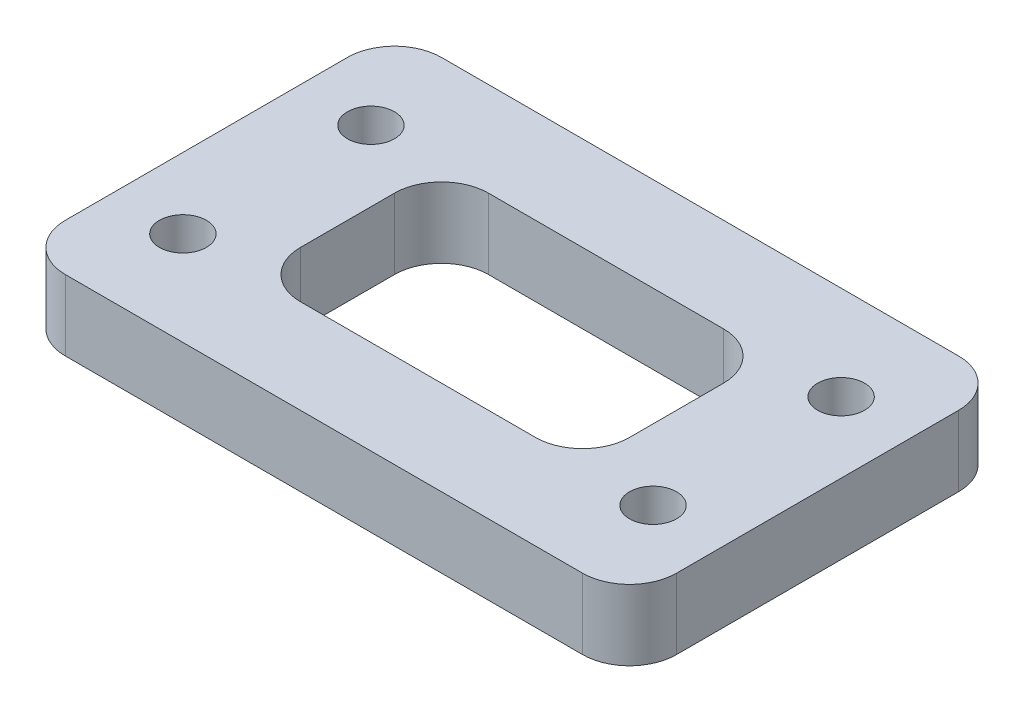
ISO-10303-21;
HEADER;
FILE_DESCRIPTION(('STEP AP214'),'2;1');
FILE_NAME('part.step','',(''),(''),'','','');
FILE_SCHEMA(('AUTOMOTIVE_DESIGN { 1 0 10303 214 1 1 1 1 }'));
ENDSEC;
DATA;
#1=APPLICATION_CONTEXT('core data for automotive mechanical design processes');
#2=APPLICATION_PROTOCOL_DEFINITION('international standard','automotive_design',2000,#1);
#3=PRODUCT_CONTEXT('',#1,'mechanical');
#4=PRODUCT('Part','Part','',(#3));
#5=PRODUCT_RELATED_PRODUCT_CATEGORY('part','',(#4));
#6=PRODUCT_DEFINITION_FORMATION('','',#4);
#7=PRODUCT_DEFINITION_CONTEXT('part definition',#1,'design');
#8=PRODUCT_DEFINITION('design','',#6,#7);
#9=PRODUCT_DEFINITION_SHAPE('','',#8);
#10=(LENGTH_UNIT() NAMED_UNIT(*) SI_UNIT(.MILLI.,.METRE.));
#11=(NAMED_UNIT(*) PLANE_ANGLE_UNIT() SI_UNIT($,.RADIAN.));
#12=(NAMED_UNIT(*) SI_UNIT($,.STERADIAN.) SOLID_ANGLE_UNIT());
#13=UNCERTAINTY_MEASURE_WITH_UNIT(LENGTH_MEASURE(1.E-05),#10,'distance_accuracy_value','');
#14=(GEOMETRIC_REPRESENTATION_CONTEXT(3) GLOBAL_UNCERTAINTY_ASSIGNED_CONTEXT((#13)) GLOBAL_UNIT_ASSIGNED_CONTEXT((#10,
#11,#12)) REPRESENTATION_CONTEXT('',''));
#15=CARTESIAN_POINT('',(0.,0.,0.));
#16=DIRECTION('',(0.,0.,1.));
#17=DIRECTION('',(1.,0.,0.));
#18=AXIS2_PLACEMENT_3D('',#15,#16,#17);
#19=CARTESIAN_POINT('',(27.5,7.5,-15.));
#20=DIRECTION('',(0.,1.,0.));
#21=DIRECTION('',(0.,0.,1.));
#22=AXIS2_PLACEMENT_3D('',#19,#20,#21);
#23=PLANE('',#22);
#24=CARTESIAN_POINT('',(-25.0000000000001,7.5,10.0000000000001));
#25=DIRECTION('',(0.,1.,0.));
#26=DIRECTION('',(0.,0.,-1.));
#27=AXIS2_PLACEMENT_3D('',#24,#25,#26);
#28=CIRCLE('',#27,2.5);
#29=CARTESIAN_POINT('',(-25.0000000000001,7.5,7.50000000000007));
#30=VERTEX_POINT('',#29);
#31=EDGE_CURVE('E211',#30,#30,#28,.T.);
#32=ORIENTED_EDGE('',*,*,#31,.F.);
#33=EDGE_LOOP('',(#32));
#34=FACE_BOUND('',#33,.T.);
#35=CARTESIAN_POINT('',(25.,7.5,-9.99999999999999));
#36=DIRECTION('',(0.,1.,0.));
#37=DIRECTION('',(0.,0.,1.));
#38=AXIS2_PLACEMENT_3D('',#35,#36,#37);
#39=CIRCLE('',#38,2.5);
#40=CARTESIAN_POINT('',(25.,7.5,-7.49999999999999));
#41=VERTEX_POINT('',#40);
#42=EDGE_CURVE('E223',#41,#41,#39,.T.);
#43=ORIENTED_EDGE('',*,*,#42,.F.);
#44=EDGE_LOOP('',(#43));
#45=FACE_BOUND('',#44,.T.);
#46=CARTESIAN_POINT('',(27.5,7.5,-15.));
#47=DIRECTION('',(0.,1.,0.));
#48=DIRECTION('',(0.,0.,1.));
#49=AXIS2_PLACEMENT_3D('',#46,#47,#48);
#50=CIRCLE('',#49,5.);
#51=CARTESIAN_POINT('',(32.5,7.5,-15.));
#52=VERTEX_POINT('',#51);
#53=CARTESIAN_POINT('',(27.5,7.5,-20.));
#54=VERTEX_POINT('',#53);
#55=EDGE_CURVE('E235',#52,#54,#50,.T.);
#56=ORIENTED_EDGE('',*,*,#55,.T.);
#57=DIRECTION('',(-1.,0.,0.));
#58=VECTOR('',#57,1.);
#59=CARTESIAN_POINT('',(27.5,7.5,-20.));
#60=LINE('',#59,#58);
#61=CARTESIAN_POINT('',(-27.5,7.5,-20.));
#62=VERTEX_POINT('',#61);
#63=EDGE_CURVE('E238',#54,#62,#60,.T.);
#64=ORIENTED_EDGE('',*,*,#63,.T.);
#65=CARTESIAN_POINT('',(-27.5,7.5,-15.));
#66=DIRECTION('',(0.,1.,0.));
#67=DIRECTION('',(0.,0.,-1.));
#68=AXIS2_PLACEMENT_3D('',#65,#66,#67);
#69=CIRCLE('',#68,5.);
#70=CARTESIAN_POINT('',(-32.5,7.5,-14.9999999999999));
#71=VERTEX_POINT('',#70);
#72=EDGE_CURVE('E241',#62,#71,#69,.T.);
#73=ORIENTED_EDGE('',*,*,#72,.T.);
#74=DIRECTION('',(0.,0.,1.));
#75=VECTOR('',#74,1.);
#76=CARTESIAN_POINT('',(-32.5,7.5,-14.9999999999999));
#77=LINE('',#76,#75);
#78=CARTESIAN_POINT('',(-32.5,7.5,15.));
#79=VERTEX_POINT('',#78);
#80=EDGE_CURVE('E243',#71,#79,#77,.T.);
#81=ORIENTED_EDGE('',*,*,#80,.T.);
#82=CARTESIAN_POINT('',(-27.5,7.5,15.));
#83=DIRECTION('',(0.,1.,0.));
#84=DIRECTION('',(0.,0.,1.));
#85=AXIS2_PLACEMENT_3D('',#82,#83,#84);
#86=CIRCLE('',#85,5.);
#87=CARTESIAN_POINT('',(-27.5,7.5,20.));
#88=VERTEX_POINT('',#87);
#89=EDGE_CURVE('E245',#79,#88,#86,.T.);
#90=ORIENTED_EDGE('',*,*,#89,.T.);
#91=DIRECTION('',(1.,0.,0.));
#92=VECTOR('',#91,1.);
#93=CARTESIAN_POINT('',(27.5,7.5,20.));
#94=LINE('',#93,#92);
#95=CARTESIAN_POINT('',(27.5,7.5,20.));
#96=VERTEX_POINT('',#95);
#97=EDGE_CURVE('E247',#88,#96,#94,.T.);
#98=ORIENTED_EDGE('',*,*,#97,.T.);
#99=CARTESIAN_POINT('',(27.5,7.5,15.));
#100=DIRECTION('',(0.,1.,0.));
#101=DIRECTION('',(0.,0.,1.));
#102=AXIS2_PLACEMENT_3D('',#99,#100,#101);
#103=CIRCLE('',#102,5.);
#104=CARTESIAN_POINT('',(32.5,7.5,15.));
#105=VERTEX_POINT('',#104);
#106=EDGE_CURVE('E249',#96,#105,#103,.T.);
#107=ORIENTED_EDGE('',*,*,#106,.T.);
#108=DIRECTION('',(0.,0.,-1.));
#109=VECTOR('',#108,1.);
#110=CARTESIAN_POINT('',(32.5,7.5,-15.));
#111=LINE('',#110,#109);
#112=EDGE_CURVE('E251',#105,#52,#111,.T.);
#113=ORIENTED_EDGE('',*,*,#112,.T.);
#114=EDGE_LOOP('',(#56,#64,#73,#81,#90,#98,#107,#113));
#115=FACE_BOUND('',#114,.T.);
#116=CARTESIAN_POINT('',(-25.,7.5,-9.99999999999998));
#117=DIRECTION('',(0.,1.,0.));
#118=DIRECTION('',(0.,0.,1.));
#119=AXIS2_PLACEMENT_3D('',#116,#117,#118);
#120=CIRCLE('',#119,2.5);
#121=CARTESIAN_POINT('',(-25.,7.5,-7.49999999999998));
#122=VERTEX_POINT('',#121);
#123=EDGE_CURVE('E229',#122,#122,#120,.T.);
#124=ORIENTED_EDGE('',*,*,#123,.F.);
#125=EDGE_LOOP('',(#124));
#126=FACE_BOUND('',#125,.T.);
#127=CARTESIAN_POINT('',(24.9999999999999,7.5,10.0000000000004));
#128=DIRECTION('',(0.,1.,0.));
#129=DIRECTION('',(0.,0.,-1.));
#130=AXIS2_PLACEMENT_3D('',#127,#128,#129);
#131=CIRCLE('',#130,2.50000000000001);
#132=CARTESIAN_POINT('',(24.9999999999999,7.5,7.50000000000042));
#133=VERTEX_POINT('',#132);
#134=EDGE_CURVE('E217',#133,#133,#131,.T.);
#135=ORIENTED_EDGE('',*,*,#134,.F.);
#136=EDGE_LOOP('',(#135));
#137=FACE_BOUND('',#136,.T.);
#138=DIRECTION('',(0.,0.,1.));
#139=VECTOR('',#138,1.);
#140=CARTESIAN_POINT('',(-17.5,7.5,-4.99999999999997));
#141=LINE('',#140,#139);
#142=CARTESIAN_POINT('',(-17.5,7.5,-4.99999999999997));
#143=VERTEX_POINT('',#142);
#144=CARTESIAN_POINT('',(-17.5,7.5,4.99999999999996));
#145=VERTEX_POINT('',#144);
#146=EDGE_CURVE('E154',#143,#145,#141,.T.);
#147=ORIENTED_EDGE('',*,*,#146,.F.);
#148=CARTESIAN_POINT('',(-12.5,7.5,-5.00000000000001));
#149=DIRECTION('',(0.,1.,0.));
#150=DIRECTION('',(0.,0.,-1.));
#151=AXIS2_PLACEMENT_3D('',#148,#149,#150);
#152=CIRCLE('',#151,5.);
#153=CARTESIAN_POINT('',(-12.4999999999999,7.5,-10.));
#154=VERTEX_POINT('',#153);
#155=EDGE_CURVE('E146',#154,#143,#152,.T.);
#156=ORIENTED_EDGE('',*,*,#155,.F.);
#157=DIRECTION('',(-1.,0.,0.));
#158=VECTOR('',#157,1.);
#159=CARTESIAN_POINT('',(12.5,7.5,-10.));
#160=LINE('',#159,#158);
#161=CARTESIAN_POINT('',(12.5,7.5,-10.));
#162=VERTEX_POINT('',#161);
#163=EDGE_CURVE('E179',#162,#154,#160,.T.);
#164=ORIENTED_EDGE('',*,*,#163,.F.);
#165=CARTESIAN_POINT('',(12.5,7.5,-5.));
#166=DIRECTION('',(0.,1.,0.));
#167=DIRECTION('',(0.,0.,1.));
#168=AXIS2_PLACEMENT_3D('',#165,#166,#167);
#169=CIRCLE('',#168,5.);
#170=CARTESIAN_POINT('',(17.5,7.5,-4.99999999999996));
#171=VERTEX_POINT('',#170);
#172=EDGE_CURVE('E177',#171,#162,#169,.T.);
#173=ORIENTED_EDGE('',*,*,#172,.F.);
#174=DIRECTION('',(0.,0.,-1.));
#175=VECTOR('',#174,1.);
#176=CARTESIAN_POINT('',(17.5,7.5,-4.99999999999996));
#177=LINE('',#176,#175);
#178=CARTESIAN_POINT('',(17.5,7.5,4.99999999999996));
#179=VERTEX_POINT('',#178);
#180=EDGE_CURVE('E175',#179,#171,#177,.T.);
#181=ORIENTED_EDGE('',*,*,#180,.F.);
#182=CARTESIAN_POINT('',(12.5,7.5,4.99999999999999));
#183=DIRECTION('',(0.,1.,0.));
#184=DIRECTION('',(0.,0.,1.));
#185=AXIS2_PLACEMENT_3D('',#182,#183,#184);
#186=CIRCLE('',#185,5.);
#187=CARTESIAN_POINT('',(12.5,7.5,9.99999999999999));
#188=VERTEX_POINT('',#187);
#189=EDGE_CURVE('E173',#188,#179,#186,.T.);
#190=ORIENTED_EDGE('',*,*,#189,.F.);
#191=DIRECTION('',(1.,0.,0.));
#192=VECTOR('',#191,1.);
#193=CARTESIAN_POINT('',(12.5,7.5,9.99999999999999));
#194=LINE('',#193,#192);
#195=CARTESIAN_POINT('',(-12.4999999999999,7.5,9.99999999999999));
#196=VERTEX_POINT('',#195);
#197=EDGE_CURVE('E169',#196,#188,#194,.T.);
#198=ORIENTED_EDGE('',*,*,#197,.F.);
#199=CARTESIAN_POINT('',(-12.5,7.5,4.99999999999999));
#200=DIRECTION('',(0.,1.,0.));
#201=DIRECTION('',(0.,0.,-1.));
#202=AXIS2_PLACEMENT_3D('',#199,#200,#201);
#203=CIRCLE('',#202,5.);
#204=EDGE_CURVE('E167',#145,#196,#203,.T.);
#205=ORIENTED_EDGE('',*,*,#204,.F.);
#206=EDGE_LOOP('',(#147,#156,#164,#173,#181,#190,#198,#205));
#207=FACE_BOUND('',#206,.T.);
#208=ADVANCED_FACE('F33',(#34,#45,#115,#126,#137,#207),#23,.T.);
#209=CARTESIAN_POINT('',(27.5,0.,-15.));
#210=DIRECTION('',(0.,1.,0.));
#211=DIRECTION('',(0.,0.,1.));
#212=AXIS2_PLACEMENT_3D('',#209,#210,#211);
#213=PLANE('',#212);
#214=CARTESIAN_POINT('',(-25.0000000000001,0.,10.0000000000001));
#215=DIRECTION('',(0.,1.,0.));
#216=DIRECTION('',(0.,0.,-1.));
#217=AXIS2_PLACEMENT_3D('',#214,#215,#216);
#218=CIRCLE('',#217,2.5);
#219=CARTESIAN_POINT('',(-25.0000000000001,0.,7.50000000000007));
#220=VERTEX_POINT('',#219);
#221=EDGE_CURVE('E162',#220,#220,#218,.T.);
#222=ORIENTED_EDGE('',*,*,#221,.T.);
#223=EDGE_LOOP('',(#222));
#224=FACE_BOUND('',#223,.T.);
#225=CARTESIAN_POINT('',(25.,0.,-9.99999999999999));
#226=DIRECTION('',(0.,1.,0.));
#227=DIRECTION('',(0.,0.,1.));
#228=AXIS2_PLACEMENT_3D('',#225,#226,#227);
#229=CIRCLE('',#228,2.5);
#230=CARTESIAN_POINT('',(25.,0.,-7.49999999999999));
#231=VERTEX_POINT('',#230);
#232=EDGE_CURVE('E220',#231,#231,#229,.T.);
#233=ORIENTED_EDGE('',*,*,#232,.T.);
#234=EDGE_LOOP('',(#233));
#235=FACE_BOUND('',#234,.T.);
#236=CARTESIAN_POINT('',(27.5,0.,-15.));
#237=DIRECTION('',(0.,1.,0.));
#238=DIRECTION('',(0.,0.,1.));
#239=AXIS2_PLACEMENT_3D('',#236,#237,#238);
#240=CIRCLE('',#239,5.);
#241=CARTESIAN_POINT('',(32.5,0.,-15.));
#242=VERTEX_POINT('',#241);
#243=CARTESIAN_POINT('',(27.5,0.,-20.));
#244=VERTEX_POINT('',#243);
#245=EDGE_CURVE('E232',#242,#244,#240,.T.);
#246=ORIENTED_EDGE('',*,*,#245,.F.);
#247=DIRECTION('',(0.,0.,-1.));
#248=VECTOR('',#247,1.);
#249=CARTESIAN_POINT('',(32.5,0.,-15.));
#250=LINE('',#249,#248);
#251=CARTESIAN_POINT('',(32.5,0.,15.));
#252=VERTEX_POINT('',#251);
#253=EDGE_CURVE('E239',#252,#242,#250,.T.);
#254=ORIENTED_EDGE('',*,*,#253,.F.);
#255=CARTESIAN_POINT('',(27.5,0.,15.));
#256=DIRECTION('',(0.,1.,0.));
#257=DIRECTION('',(0.,0.,1.));
#258=AXIS2_PLACEMENT_3D('',#255,#256,#257);
#259=CIRCLE('',#258,5.);
#260=CARTESIAN_POINT('',(27.5,0.,20.));
#261=VERTEX_POINT('',#260);
#262=EDGE_CURVE('E266',#261,#252,#259,.T.);
#263=ORIENTED_EDGE('',*,*,#262,.F.);
#264=DIRECTION('',(1.,0.,0.));
#265=VECTOR('',#264,1.);
#266=CARTESIAN_POINT('',(27.5,0.,20.));
#267=LINE('',#266,#265);
#268=CARTESIAN_POINT('',(-27.5,0.,20.));
#269=VERTEX_POINT('',#268);
#270=EDGE_CURVE('E264',#269,#261,#267,.T.);
#271=ORIENTED_EDGE('',*,*,#270,.F.);
#272=CARTESIAN_POINT('',(-27.5,0.,15.));
#273=DIRECTION('',(0.,1.,0.));
#274=DIRECTION('',(0.,0.,1.));
#275=AXIS2_PLACEMENT_3D('',#272,#273,#274);
#276=CIRCLE('',#275,5.);
#277=CARTESIAN_POINT('',(-32.5,0.,15.));
#278=VERTEX_POINT('',#277);
#279=EDGE_CURVE('E262',#278,#269,#276,.T.);
#280=ORIENTED_EDGE('',*,*,#279,.F.);
#281=DIRECTION('',(0.,0.,1.));
#282=VECTOR('',#281,1.);
#283=CARTESIAN_POINT('',(-32.5,0.,-14.9999999999999));
#284=LINE('',#283,#282);
#285=CARTESIAN_POINT('',(-32.5,0.,-14.9999999999999));
#286=VERTEX_POINT('',#285);
#287=EDGE_CURVE('E260',#286,#278,#284,.T.);
#288=ORIENTED_EDGE('',*,*,#287,.F.);
#289=CARTESIAN_POINT('',(-27.5,0.,-15.));
#290=DIRECTION('',(0.,1.,0.));
#291=DIRECTION('',(0.,0.,-1.));
#292=AXIS2_PLACEMENT_3D('',#289,#290,#291);
#293=CIRCLE('',#292,5.);
#294=CARTESIAN_POINT('',(-27.5,0.,-20.));
#295=VERTEX_POINT('',#294);
#296=EDGE_CURVE('E258',#295,#286,#293,.T.);
#297=ORIENTED_EDGE('',*,*,#296,.F.);
#298=DIRECTION('',(-1.,0.,0.));
#299=VECTOR('',#298,1.);
#300=CARTESIAN_POINT('',(27.5,0.,-20.));
#301=LINE('',#300,#299);
#302=EDGE_CURVE('E256',#244,#295,#301,.T.);
#303=ORIENTED_EDGE('',*,*,#302,.F.);
#304=EDGE_LOOP('',(#246,#254,#263,#271,#280,#288,#297,#303));
#305=FACE_BOUND('',#304,.T.);
#306=CARTESIAN_POINT('',(-25.,0.,-9.99999999999998));
#307=DIRECTION('',(0.,1.,0.));
#308=DIRECTION('',(0.,0.,1.));
#309=AXIS2_PLACEMENT_3D('',#306,#307,#308);
#310=CIRCLE('',#309,2.5);
#311=CARTESIAN_POINT('',(-25.,0.,-7.49999999999998));
#312=VERTEX_POINT('',#311);
#313=EDGE_CURVE('E226',#312,#312,#310,.T.);
#314=ORIENTED_EDGE('',*,*,#313,.T.);
#315=EDGE_LOOP('',(#314));
#316=FACE_BOUND('',#315,.T.);
#317=CARTESIAN_POINT('',(24.9999999999999,0.,10.0000000000004));
#318=DIRECTION('',(0.,1.,0.));
#319=DIRECTION('',(0.,0.,-1.));
#320=AXIS2_PLACEMENT_3D('',#317,#318,#319);
#321=CIRCLE('',#320,2.50000000000001);
#322=CARTESIAN_POINT('',(24.9999999999999,0.,7.50000000000042));
#323=VERTEX_POINT('',#322);
#324=EDGE_CURVE('E214',#323,#323,#321,.T.);
#325=ORIENTED_EDGE('',*,*,#324,.T.);
#326=EDGE_LOOP('',(#325));
#327=FACE_BOUND('',#326,.T.);
#328=CARTESIAN_POINT('',(-12.5,0.,-5.00000000000001));
#329=DIRECTION('',(0.,1.,0.));
#330=DIRECTION('',(0.,0.,-1.));
#331=AXIS2_PLACEMENT_3D('',#328,#329,#330);
#332=CIRCLE('',#331,5.);
#333=CARTESIAN_POINT('',(-12.4999999999999,0.,-10.));
#334=VERTEX_POINT('',#333);
#335=CARTESIAN_POINT('',(-17.5,0.,-4.99999999999997));
#336=VERTEX_POINT('',#335);
#337=EDGE_CURVE('E56',#334,#336,#332,.T.);
#338=ORIENTED_EDGE('',*,*,#337,.T.);
#339=DIRECTION('',(0.,0.,1.));
#340=VECTOR('',#339,1.);
#341=CARTESIAN_POINT('',(-17.5,0.,-4.99999999999997));
#342=LINE('',#341,#340);
#343=CARTESIAN_POINT('',(-17.5,0.,4.99999999999996));
#344=VERTEX_POINT('',#343);
#345=EDGE_CURVE('E161',#336,#344,#342,.T.);
#346=ORIENTED_EDGE('',*,*,#345,.T.);
#347=CARTESIAN_POINT('',(-12.5,0.,4.99999999999999));
#348=DIRECTION('',(0.,1.,0.));
#349=DIRECTION('',(0.,0.,-1.));
#350=AXIS2_PLACEMENT_3D('',#347,#348,#349);
#351=CIRCLE('',#350,5.);
#352=CARTESIAN_POINT('',(-12.4999999999999,0.,9.99999999999999));
#353=VERTEX_POINT('',#352);
#354=EDGE_CURVE('E183',#344,#353,#351,.T.);
#355=ORIENTED_EDGE('',*,*,#354,.T.);
#356=DIRECTION('',(1.,0.,0.));
#357=VECTOR('',#356,1.);
#358=CARTESIAN_POINT('',(12.5,0.,9.99999999999999));
#359=LINE('',#358,#357);
#360=CARTESIAN_POINT('',(12.5,0.,9.99999999999999));
#361=VERTEX_POINT('',#360);
#362=EDGE_CURVE('E186',#353,#361,#359,.T.);
#363=ORIENTED_EDGE('',*,*,#362,.T.);
#364=CARTESIAN_POINT('',(12.5,0.,4.99999999999999));
#365=DIRECTION('',(0.,1.,0.));
#366=DIRECTION('',(0.,0.,1.));
#367=AXIS2_PLACEMENT_3D('',#364,#365,#366);
#368=CIRCLE('',#367,5.);
#369=CARTESIAN_POINT('',(17.5,0.,4.99999999999996));
#370=VERTEX_POINT('',#369);
#371=EDGE_CURVE('E189',#361,#370,#368,.T.);
#372=ORIENTED_EDGE('',*,*,#371,.T.);
#373=DIRECTION('',(0.,0.,-1.));
#374=VECTOR('',#373,1.);
#375=CARTESIAN_POINT('',(17.5,0.,-4.99999999999996));
#376=LINE('',#375,#374);
#377=CARTESIAN_POINT('',(17.5,0.,-4.99999999999996));
#378=VERTEX_POINT('',#377);
#379=EDGE_CURVE('E192',#370,#378,#376,.T.);
#380=ORIENTED_EDGE('',*,*,#379,.T.);
#381=CARTESIAN_POINT('',(12.5,0.,-5.));
#382=DIRECTION('',(0.,1.,0.));
#383=DIRECTION('',(0.,0.,1.));
#384=AXIS2_PLACEMENT_3D('',#381,#382,#383);
#385=CIRCLE('',#384,5.);
#386=CARTESIAN_POINT('',(12.5,0.,-10.));
#387=VERTEX_POINT('',#386);
#388=EDGE_CURVE('E195',#378,#387,#385,.T.);
#389=ORIENTED_EDGE('',*,*,#388,.T.);
#390=DIRECTION('',(-1.,0.,0.));
#391=VECTOR('',#390,1.);
#392=CARTESIAN_POINT('',(12.5,0.,-10.));
#393=LINE('',#392,#391);
#394=EDGE_CURVE('E155',#387,#334,#393,.T.);
#395=ORIENTED_EDGE('',*,*,#394,.T.);
#396=EDGE_LOOP('',(#338,#346,#355,#363,#372,#380,#389,#395));
#397=FACE_BOUND('',#396,.T.);
#398=ADVANCED_FACE('F296',(#224,#235,#305,#316,#327,#397),#213,.F.);
#399=CARTESIAN_POINT('',(27.5,7.5,-15.));
#400=DIRECTION('',(0.,-1.,0.));
#401=DIRECTION('',(0.,0.,-1.));
#402=AXIS2_PLACEMENT_3D('',#399,#400,#401);
#403=CYLINDRICAL_SURFACE('',#402,5.);
#404=ORIENTED_EDGE('',*,*,#245,.T.);
#405=DIRECTION('',(0.,-1.,0.));
#406=VECTOR('',#405,1.);
#407=CARTESIAN_POINT('',(27.5,7.5,-20.));
#408=LINE('',#407,#406);
#409=EDGE_CURVE('E11',#54,#244,#408,.T.);
#410=ORIENTED_EDGE('',*,*,#409,.F.);
#411=ORIENTED_EDGE('',*,*,#55,.F.);
#412=DIRECTION('',(0.,-1.,0.));
#413=VECTOR('',#412,1.);
#414=CARTESIAN_POINT('',(32.5,7.5,-15.));
#415=LINE('',#414,#413);
#416=EDGE_CURVE('E253',#52,#242,#415,.T.);
#417=ORIENTED_EDGE('',*,*,#416,.T.);
#418=EDGE_LOOP('',(#404,#410,#411,#417));
#419=FACE_BOUND('',#418,.T.);
#420=ADVANCED_FACE('F35',(#419),#403,.T.);
#421=CARTESIAN_POINT('',(27.5,7.5,-20.));
#422=DIRECTION('',(0.,0.,1.));
#423=DIRECTION('',(1.,0.,0.));
#424=AXIS2_PLACEMENT_3D('',#421,#422,#423);
#425=PLANE('',#424);
#426=ORIENTED_EDGE('',*,*,#302,.T.);
#427=DIRECTION('',(0.,-1.,0.));
#428=VECTOR('',#427,1.);
#429=CARTESIAN_POINT('',(-27.5,7.5,-20.));
#430=LINE('',#429,#428);
#431=EDGE_CURVE('E41',#62,#295,#430,.T.);
#432=ORIENTED_EDGE('',*,*,#431,.F.);
#433=ORIENTED_EDGE('',*,*,#63,.F.);
#434=ORIENTED_EDGE('',*,*,#409,.T.);
#435=EDGE_LOOP('',(#426,#432,#433,#434));
#436=FACE_BOUND('',#435,.T.);
#437=ADVANCED_FACE('F314',(#436),#425,.F.);
#438=CARTESIAN_POINT('',(-27.5,7.5,-15.));
#439=DIRECTION('',(0.,-1.,0.));
#440=DIRECTION('',(0.,0.,-1.));
#441=AXIS2_PLACEMENT_3D('',#438,#439,#440);
#442=CYLINDRICAL_SURFACE('',#441,5.);
#443=ORIENTED_EDGE('',*,*,#296,.T.);
#444=DIRECTION('',(0.,-1.,0.));
#445=VECTOR('',#444,1.);
#446=CARTESIAN_POINT('',(-32.5,7.5,-14.9999999999999));
#447=LINE('',#446,#445);
#448=EDGE_CURVE('E283',#71,#286,#447,.T.);
#449=ORIENTED_EDGE('',*,*,#448,.F.);
#450=ORIENTED_EDGE('',*,*,#72,.F.);
#451=ORIENTED_EDGE('',*,*,#431,.T.);
#452=EDGE_LOOP('',(#443,#449,#450,#451));
#453=FACE_BOUND('',#452,.T.);
#454=ADVANCED_FACE('F290',(#453),#442,.T.);
#455=CARTESIAN_POINT('',(-32.5,7.5,-14.9999999999999));
#456=DIRECTION('',(1.,0.,0.));
#457=DIRECTION('',(0.,0.,-1.));
#458=AXIS2_PLACEMENT_3D('',#455,#456,#457);
#459=PLANE('',#458);
#460=ORIENTED_EDGE('',*,*,#287,.T.);
#461=DIRECTION('',(0.,-1.,0.));
#462=VECTOR('',#461,1.);
#463=CARTESIAN_POINT('',(-32.5,7.5,15.));
#464=LINE('',#463,#462);
#465=EDGE_CURVE('E280',#79,#278,#464,.T.);
#466=ORIENTED_EDGE('',*,*,#465,.F.);
#467=ORIENTED_EDGE('',*,*,#80,.F.);
#468=ORIENTED_EDGE('',*,*,#448,.T.);
#469=EDGE_LOOP('',(#460,#466,#467,#468));
#470=FACE_BOUND('',#469,.T.);
#471=ADVANCED_FACE('F302',(#470),#459,.F.);
#472=CARTESIAN_POINT('',(-27.5,7.5,15.));
#473=DIRECTION('',(0.,-1.,0.));
#474=DIRECTION('',(0.,0.,-1.));
#475=AXIS2_PLACEMENT_3D('',#472,#473,#474);
#476=CYLINDRICAL_SURFACE('',#475,5.);
#477=ORIENTED_EDGE('',*,*,#279,.T.);
#478=DIRECTION('',(0.,-1.,0.));
#479=VECTOR('',#478,1.);
#480=CARTESIAN_POINT('',(-27.5,7.5,20.));
#481=LINE('',#480,#479);
#482=EDGE_CURVE('E277',#88,#269,#481,.T.);
#483=ORIENTED_EDGE('',*,*,#482,.F.);
#484=ORIENTED_EDGE('',*,*,#89,.F.);
#485=ORIENTED_EDGE('',*,*,#465,.T.);
#486=EDGE_LOOP('',(#477,#483,#484,#485));
#487=FACE_BOUND('',#486,.T.);
#488=ADVANCED_FACE('F306',(#487),#476,.T.);
#489=CARTESIAN_POINT('',(27.5,7.5,20.));
#490=DIRECTION('',(0.,0.,-1.));
#491=DIRECTION('',(-1.,0.,0.));
#492=AXIS2_PLACEMENT_3D('',#489,#490,#491);
#493=PLANE('',#492);
#494=ORIENTED_EDGE('',*,*,#270,.T.);
#495=DIRECTION('',(0.,-1.,0.));
#496=VECTOR('',#495,1.);
#497=CARTESIAN_POINT('',(27.5,7.5,20.));
#498=LINE('',#497,#496);
#499=EDGE_CURVE('E274',#96,#261,#498,.T.);
#500=ORIENTED_EDGE('',*,*,#499,.F.);
#501=ORIENTED_EDGE('',*,*,#97,.F.);
#502=ORIENTED_EDGE('',*,*,#482,.T.);
#503=EDGE_LOOP('',(#494,#500,#501,#502));
#504=FACE_BOUND('',#503,.T.);
#505=ADVANCED_FACE('F327',(#504),#493,.F.);
#506=CARTESIAN_POINT('',(27.5,7.5,15.));
#507=DIRECTION('',(0.,-1.,0.));
#508=DIRECTION('',(0.,0.,-1.));
#509=AXIS2_PLACEMENT_3D('',#506,#507,#508);
#510=CYLINDRICAL_SURFACE('',#509,5.);
#511=ORIENTED_EDGE('',*,*,#262,.T.);
#512=DIRECTION('',(0.,-1.,0.));
#513=VECTOR('',#512,1.);
#514=CARTESIAN_POINT('',(32.5,7.5,15.));
#515=LINE('',#514,#513);
#516=EDGE_CURVE('E271',#105,#252,#515,.T.);
#517=ORIENTED_EDGE('',*,*,#516,.F.);
#518=ORIENTED_EDGE('',*,*,#106,.F.);
#519=ORIENTED_EDGE('',*,*,#499,.T.);
#520=EDGE_LOOP('',(#511,#517,#518,#519));
#521=FACE_BOUND('',#520,.T.);
#522=ADVANCED_FACE('F325',(#521),#510,.T.);
#523=CARTESIAN_POINT('',(32.5,7.5,-15.));
#524=DIRECTION('',(-1.,0.,0.));
#525=DIRECTION('',(0.,0.,1.));
#526=AXIS2_PLACEMENT_3D('',#523,#524,#525);
#527=PLANE('',#526);
#528=ORIENTED_EDGE('',*,*,#253,.T.);
#529=ORIENTED_EDGE('',*,*,#416,.F.);
#530=ORIENTED_EDGE('',*,*,#112,.F.);
#531=ORIENTED_EDGE('',*,*,#516,.T.);
#532=EDGE_LOOP('',(#528,#529,#530,#531));
#533=FACE_BOUND('',#532,.T.);
#534=ADVANCED_FACE('F320',(#533),#527,.F.);
#535=CARTESIAN_POINT('',(-25.,7.5,-9.99999999999998));
#536=DIRECTION('',(0.,-1.,0.));
#537=DIRECTION('',(0.,0.,-1.));
#538=AXIS2_PLACEMENT_3D('',#535,#536,#537);
#539=CYLINDRICAL_SURFACE('',#538,2.5);
#540=ORIENTED_EDGE('',*,*,#123,.T.);
#541=EDGE_LOOP('',(#540));
#542=FACE_BOUND('',#541,.T.);
#543=ORIENTED_EDGE('',*,*,#313,.F.);
#544=EDGE_LOOP('',(#543));
#545=FACE_BOUND('',#544,.T.);
#546=ADVANCED_FACE('F347',(#542,#545),#539,.F.);
#547=CARTESIAN_POINT('',(25.,7.5,-9.99999999999999));
#548=DIRECTION('',(0.,-1.,0.));
#549=DIRECTION('',(0.,0.,-1.));
#550=AXIS2_PLACEMENT_3D('',#547,#548,#549);
#551=CYLINDRICAL_SURFACE('',#550,2.5);
#552=ORIENTED_EDGE('',*,*,#42,.T.);
#553=EDGE_LOOP('',(#552));
#554=FACE_BOUND('',#553,.T.);
#555=ORIENTED_EDGE('',*,*,#232,.F.);
#556=EDGE_LOOP('',(#555));
#557=FACE_BOUND('',#556,.T.);
#558=ADVANCED_FACE('F354',(#554,#557),#551,.F.);
#559=CARTESIAN_POINT('',(24.9999999999999,7.5,10.0000000000004));
#560=DIRECTION('',(0.,-1.,0.));
#561=DIRECTION('',(0.,0.,-1.));
#562=AXIS2_PLACEMENT_3D('',#559,#560,#561);
#563=CYLINDRICAL_SURFACE('',#562,2.50000000000001);
#564=ORIENTED_EDGE('',*,*,#134,.T.);
#565=EDGE_LOOP('',(#564));
#566=FACE_BOUND('',#565,.T.);
#567=ORIENTED_EDGE('',*,*,#324,.F.);
#568=EDGE_LOOP('',(#567));
#569=FACE_BOUND('',#568,.T.);
#570=ADVANCED_FACE('F359',(#566,#569),#563,.F.);
#571=CARTESIAN_POINT('',(-25.0000000000001,7.5,10.0000000000001));
#572=DIRECTION('',(0.,-1.,0.));
#573=DIRECTION('',(0.,0.,-1.));
#574=AXIS2_PLACEMENT_3D('',#571,#572,#573);
#575=CYLINDRICAL_SURFACE('',#574,2.5);
#576=ORIENTED_EDGE('',*,*,#31,.T.);
#577=EDGE_LOOP('',(#576));
#578=FACE_BOUND('',#577,.T.);
#579=ORIENTED_EDGE('',*,*,#221,.F.);
#580=EDGE_LOOP('',(#579));
#581=FACE_BOUND('',#580,.T.);
#582=ADVANCED_FACE('F402',(#578,#581),#575,.F.);
#583=CARTESIAN_POINT('',(-12.5,7.5,-5.00000000000001));
#584=DIRECTION('',(0.,-1.,0.));
#585=DIRECTION('',(0.,0.,-1.));
#586=AXIS2_PLACEMENT_3D('',#583,#584,#585);
#587=CYLINDRICAL_SURFACE('',#586,5.);
#588=ORIENTED_EDGE('',*,*,#337,.F.);
#589=DIRECTION('',(0.,-1.,0.));
#590=VECTOR('',#589,1.);
#591=CARTESIAN_POINT('',(-12.4999999999999,7.5,-10.));
#592=LINE('',#591,#590);
#593=EDGE_CURVE('E150',#154,#334,#592,.T.);
#594=ORIENTED_EDGE('',*,*,#593,.F.);
#595=ORIENTED_EDGE('',*,*,#155,.T.);
#596=DIRECTION('',(0.,-1.,0.));
#597=VECTOR('',#596,1.);
#598=CARTESIAN_POINT('',(-17.5,7.5,-4.99999999999997));
#599=LINE('',#598,#597);
#600=EDGE_CURVE('E149',#143,#336,#599,.T.);
#601=ORIENTED_EDGE('',*,*,#600,.T.);
#602=EDGE_LOOP('',(#588,#594,#595,#601));
#603=FACE_BOUND('',#602,.T.);
#604=ADVANCED_FACE('F148',(#603),#587,.F.);
#605=CARTESIAN_POINT('',(-17.5,7.5,-4.99999999999997));
#606=DIRECTION('',(1.,0.,0.));
#607=DIRECTION('',(0.,0.,-1.));
#608=AXIS2_PLACEMENT_3D('',#605,#606,#607);
#609=PLANE('',#608);
#610=ORIENTED_EDGE('',*,*,#345,.F.);
#611=ORIENTED_EDGE('',*,*,#600,.F.);
#612=ORIENTED_EDGE('',*,*,#146,.T.);
#613=DIRECTION('',(0.,-1.,0.));
#614=VECTOR('',#613,1.);
#615=CARTESIAN_POINT('',(-17.5,7.5,4.99999999999996));
#616=LINE('',#615,#614);
#617=EDGE_CURVE('E163',#145,#344,#616,.T.);
#618=ORIENTED_EDGE('',*,*,#617,.T.);
#619=EDGE_LOOP('',(#610,#611,#612,#618));
#620=FACE_BOUND('',#619,.T.);
#621=ADVANCED_FACE('F158',(#620),#609,.T.);
#622=CARTESIAN_POINT('',(-12.5,7.5,4.99999999999999));
#623=DIRECTION('',(0.,-1.,0.));
#624=DIRECTION('',(0.,0.,-1.));
#625=AXIS2_PLACEMENT_3D('',#622,#623,#624);
#626=CYLINDRICAL_SURFACE('',#625,5.);
#627=ORIENTED_EDGE('',*,*,#354,.F.);
#628=ORIENTED_EDGE('',*,*,#617,.F.);
#629=ORIENTED_EDGE('',*,*,#204,.T.);
#630=DIRECTION('',(0.,-1.,0.));
#631=VECTOR('',#630,1.);
#632=CARTESIAN_POINT('',(-12.4999999999999,7.5,9.99999999999999));
#633=LINE('',#632,#631);
#634=EDGE_CURVE('E208',#196,#353,#633,.T.);
#635=ORIENTED_EDGE('',*,*,#634,.T.);
#636=EDGE_LOOP('',(#627,#628,#629,#635));
#637=FACE_BOUND('',#636,.T.);
#638=ADVANCED_FACE('F389',(#637),#626,.F.);
#639=CARTESIAN_POINT('',(12.5,7.5,9.99999999999999));
#640=DIRECTION('',(0.,0.,-1.));
#641=DIRECTION('',(-1.,0.,0.));
#642=AXIS2_PLACEMENT_3D('',#639,#640,#641);
#643=PLANE('',#642);
#644=ORIENTED_EDGE('',*,*,#362,.F.);
#645=ORIENTED_EDGE('',*,*,#634,.F.);
#646=ORIENTED_EDGE('',*,*,#197,.T.);
#647=DIRECTION('',(0.,-1.,0.));
#648=VECTOR('',#647,1.);
#649=CARTESIAN_POINT('',(12.5,7.5,9.99999999999999));
#650=LINE('',#649,#648);
#651=EDGE_CURVE('E206',#188,#361,#650,.T.);
#652=ORIENTED_EDGE('',*,*,#651,.T.);
#653=EDGE_LOOP('',(#644,#645,#646,#652));
#654=FACE_BOUND('',#653,.T.);
#655=ADVANCED_FACE('F386',(#654),#643,.T.);
#656=CARTESIAN_POINT('',(12.5,7.5,4.99999999999999));
#657=DIRECTION('',(0.,-1.,0.));
#658=DIRECTION('',(0.,0.,-1.));
#659=AXIS2_PLACEMENT_3D('',#656,#657,#658);
#660=CYLINDRICAL_SURFACE('',#659,5.);
#661=ORIENTED_EDGE('',*,*,#371,.F.);
#662=ORIENTED_EDGE('',*,*,#651,.F.);
#663=ORIENTED_EDGE('',*,*,#189,.T.);
#664=DIRECTION('',(0.,-1.,0.));
#665=VECTOR('',#664,1.);
#666=CARTESIAN_POINT('',(17.5,7.5,4.99999999999996));
#667=LINE('',#666,#665);
#668=EDGE_CURVE('E204',#179,#370,#667,.T.);
#669=ORIENTED_EDGE('',*,*,#668,.T.);
#670=EDGE_LOOP('',(#661,#662,#663,#669));
#671=FACE_BOUND('',#670,.T.);
#672=ADVANCED_FACE('F381',(#671),#660,.F.);
#673=CARTESIAN_POINT('',(17.5,7.5,-4.99999999999996));
#674=DIRECTION('',(-1.,0.,0.));
#675=DIRECTION('',(0.,0.,1.));
#676=AXIS2_PLACEMENT_3D('',#673,#674,#675);
#677=PLANE('',#676);
#678=ORIENTED_EDGE('',*,*,#379,.F.);
#679=ORIENTED_EDGE('',*,*,#668,.F.);
#680=ORIENTED_EDGE('',*,*,#180,.T.);
#681=DIRECTION('',(0.,-1.,0.));
#682=VECTOR('',#681,1.);
#683=CARTESIAN_POINT('',(17.5,7.5,-4.99999999999996));
#684=LINE('',#683,#682);
#685=EDGE_CURVE('E202',#171,#378,#684,.T.);
#686=ORIENTED_EDGE('',*,*,#685,.T.);
#687=EDGE_LOOP('',(#678,#679,#680,#686));
#688=FACE_BOUND('',#687,.T.);
#689=ADVANCED_FACE('F377',(#688),#677,.T.);
#690=CARTESIAN_POINT('',(12.5,7.5,-5.));
#691=DIRECTION('',(0.,-1.,0.));
#692=DIRECTION('',(0.,0.,-1.));
#693=AXIS2_PLACEMENT_3D('',#690,#691,#692);
#694=CYLINDRICAL_SURFACE('',#693,5.);
#695=ORIENTED_EDGE('',*,*,#388,.F.);
#696=ORIENTED_EDGE('',*,*,#685,.F.);
#697=ORIENTED_EDGE('',*,*,#172,.T.);
#698=DIRECTION('',(0.,-1.,0.));
#699=VECTOR('',#698,1.);
#700=CARTESIAN_POINT('',(12.5,7.5,-10.));
#701=LINE('',#700,#699);
#702=EDGE_CURVE('E48',#162,#387,#701,.T.);
#703=ORIENTED_EDGE('',*,*,#702,.T.);
#704=EDGE_LOOP('',(#695,#696,#697,#703));
#705=FACE_BOUND('',#704,.T.);
#706=ADVANCED_FACE('F374',(#705),#694,.F.);
#707=CARTESIAN_POINT('',(12.5,7.5,-10.));
#708=DIRECTION('',(0.,0.,1.));
#709=DIRECTION('',(1.,0.,0.));
#710=AXIS2_PLACEMENT_3D('',#707,#708,#709);
#711=PLANE('',#710);
#712=ORIENTED_EDGE('',*,*,#394,.F.);
#713=ORIENTED_EDGE('',*,*,#702,.F.);
#714=ORIENTED_EDGE('',*,*,#163,.T.);
#715=ORIENTED_EDGE('',*,*,#593,.T.);
#716=EDGE_LOOP('',(#712,#713,#714,#715));
#717=FACE_BOUND('',#716,.T.);
#718=ADVANCED_FACE('F368',(#717),#711,.T.);
#719=CLOSED_SHELL('',(#208,#398,#420,#437,#454,#471,#488,#505,#522,#534,#546,#558,#570,#582,
#604,#621,#638,#655,#672,#689,#706,#718));
#720=MANIFOLD_SOLID_BREP('B2',#719);
#721=ADVANCED_BREP_SHAPE_REPRESENTATION('',(#18,#720),#14);
#722=SHAPE_DEFINITION_REPRESENTATION(#9,#721);
ENDSEC;
END-ISO-10303-21;
